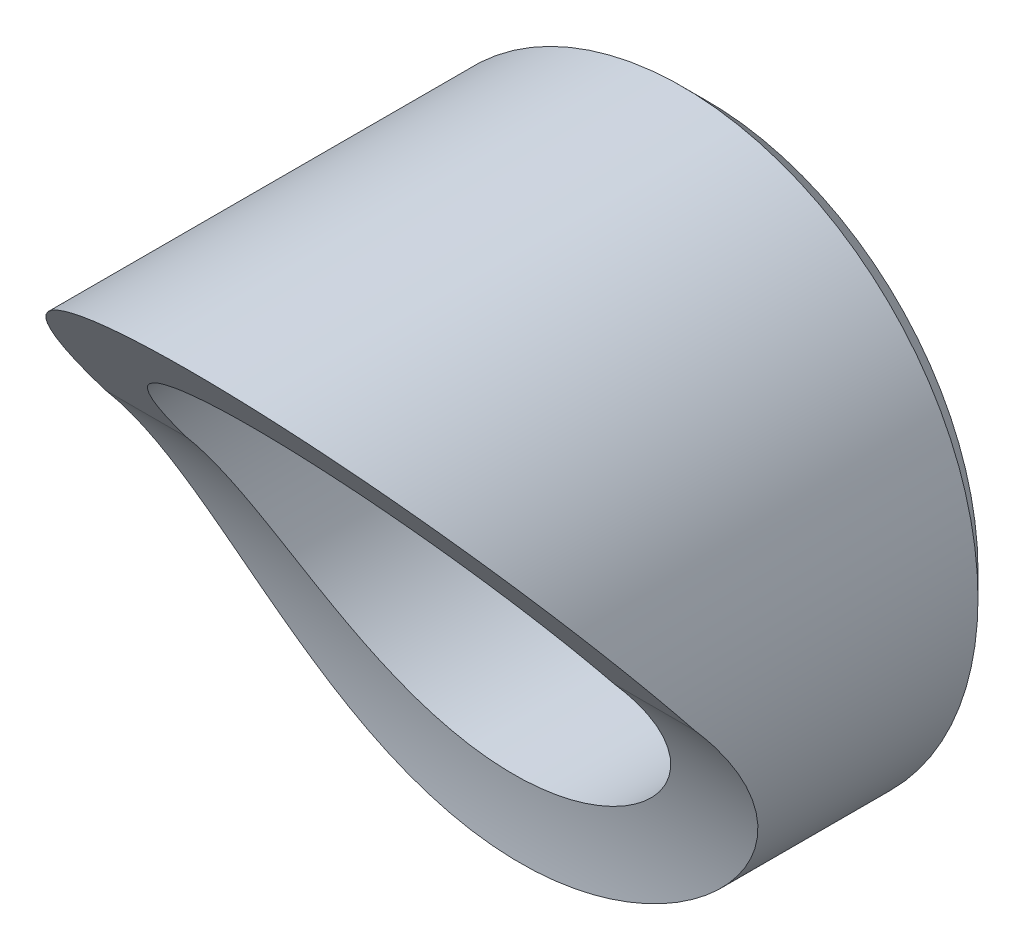
ISO-10303-21;
HEADER;
FILE_DESCRIPTION(('STEP AP214'),'2;1');
FILE_NAME('part.step','',(''),(''),'','','');
FILE_SCHEMA(('AUTOMOTIVE_DESIGN { 1 0 10303 214 1 1 1 1 }'));
ENDSEC;
DATA;
#1=APPLICATION_CONTEXT('core data for automotive mechanical design processes');
#2=APPLICATION_PROTOCOL_DEFINITION('international standard','automotive_design',2000,#1);
#3=PRODUCT_CONTEXT('',#1,'mechanical');
#4=PRODUCT('Part','Part','',(#3));
#5=PRODUCT_RELATED_PRODUCT_CATEGORY('part','',(#4));
#6=PRODUCT_DEFINITION_FORMATION('','',#4);
#7=PRODUCT_DEFINITION_CONTEXT('part definition',#1,'design');
#8=PRODUCT_DEFINITION('design','',#6,#7);
#9=PRODUCT_DEFINITION_SHAPE('','',#8);
#10=(LENGTH_UNIT() NAMED_UNIT(*) SI_UNIT(.MILLI.,.METRE.));
#11=(NAMED_UNIT(*) PLANE_ANGLE_UNIT() SI_UNIT($,.RADIAN.));
#12=(NAMED_UNIT(*) SI_UNIT($,.STERADIAN.) SOLID_ANGLE_UNIT());
#13=UNCERTAINTY_MEASURE_WITH_UNIT(LENGTH_MEASURE(1.E-05),#10,'distance_accuracy_value','');
#14=(GEOMETRIC_REPRESENTATION_CONTEXT(3) GLOBAL_UNCERTAINTY_ASSIGNED_CONTEXT((#13)) GLOBAL_UNIT_ASSIGNED_CONTEXT((#10,
#11,#12)) REPRESENTATION_CONTEXT('',''));
#15=CARTESIAN_POINT('',(0.,0.,0.));
#16=DIRECTION('',(0.,0.,1.));
#17=DIRECTION('',(1.,0.,0.));
#18=AXIS2_PLACEMENT_3D('',#15,#16,#17);
#19=CARTESIAN_POINT('',(0.,0.,0.));
#20=DIRECTION('',(0.,0.,1.));
#21=DIRECTION('',(1.,0.,0.));
#22=AXIS2_PLACEMENT_3D('',#19,#20,#21);
#23=PLANE('',#22);
#24=CARTESIAN_POINT('',(0.,0.,0.));
#25=DIRECTION('',(0.,0.,1.));
#26=DIRECTION('',(1.,0.,0.));
#27=AXIS2_PLACEMENT_3D('',#24,#25,#26);
#28=CIRCLE('',#27,11.);
#29=CARTESIAN_POINT('',(11.,0.,0.));
#30=VERTEX_POINT('',#29);
#31=EDGE_CURVE('E11',#30,#30,#28,.F.);
#32=ORIENTED_EDGE('',*,*,#31,.T.);
#33=EDGE_LOOP('',(#32));
#34=FACE_BOUND('',#33,.T.);
#35=CARTESIAN_POINT('',(0.,0.,0.));
#36=DIRECTION('',(0.,0.,-1.));
#37=DIRECTION('',(-1.,0.,0.));
#38=AXIS2_PLACEMENT_3D('',#35,#36,#37);
#39=CIRCLE('',#38,8.74999999999999);
#40=CARTESIAN_POINT('',(-8.74999999999999,0.,0.));
#41=VERTEX_POINT('',#40);
#42=EDGE_CURVE('E75',#41,#41,#39,.T.);
#43=ORIENTED_EDGE('',*,*,#42,.F.);
#44=EDGE_LOOP('',(#43));
#45=FACE_BOUND('',#44,.T.);
#46=ADVANCED_FACE('F37',(#34,#45),#23,.F.);
#47=CARTESIAN_POINT('',(0.,0.,21.));
#48=DIRECTION('',(0.,0.,-1.));
#49=DIRECTION('',(-1.,0.,0.));
#50=AXIS2_PLACEMENT_3D('',#47,#48,#49);
#51=CYLINDRICAL_SURFACE('',#50,12.);
#52=CARTESIAN_POINT('',(0.,0.,1.00000000000003));
#53=DIRECTION('',(0.,0.,1.));
#54=DIRECTION('',(1.,0.,0.));
#55=AXIS2_PLACEMENT_3D('',#52,#53,#54);
#56=CIRCLE('',#55,12.);
#57=CARTESIAN_POINT('',(12.,0.,1.00000000000003));
#58=VERTEX_POINT('',#57);
#59=EDGE_CURVE('E45',#58,#58,#56,.T.);
#60=ORIENTED_EDGE('',*,*,#59,.T.);
#61=EDGE_LOOP('',(#60));
#62=FACE_BOUND('',#61,.T.);
#63=CARTESIAN_POINT('',(-11.9532085110365,1.05868139290517,12.4517050372462));
#64=CARTESIAN_POINT('',(-11.9649680485447,0.925899042406535,12.3372383249539));
#65=CARTESIAN_POINT('',(-11.9746410331154,0.791512872460983,12.2244347730754));
#66=CARTESIAN_POINT('',(-11.9895163860847,0.519654237816515,12.0022731914124));
#67=CARTESIAN_POINT('',(-11.9947182092425,0.382181398807218,11.8929155834132));
#68=CARTESIAN_POINT('',(-12.0031713325132,-0.0348511411528026,11.5700651600148));
#69=CARTESIAN_POINT('',(-11.9992511327767,-0.318818687778992,11.3619725343735));
#70=CARTESIAN_POINT('',(-11.9698803592871,-0.898036923727318,10.9605528830697));
#71=CARTESIAN_POINT('',(-11.9443230607443,-1.19333660342622,10.7673042381404));
#72=CARTESIAN_POINT('',(-11.8693470507308,-1.79147760951586,10.3979786869024));
#73=CARTESIAN_POINT('',(-11.8199360247676,-2.094316477046,10.2218962717));
#74=CARTESIAN_POINT('',(-11.6949410153717,-2.70678359842109,9.88676224656956));
#75=CARTESIAN_POINT('',(-11.6191826594557,-3.01644387790017,9.72783358408849));
#76=CARTESIAN_POINT('',(-11.4400940046577,-3.63710853611669,9.42912608707081));
#77=CARTESIAN_POINT('',(-11.3367609457437,-3.94811304633474,9.28934917160895));
#78=CARTESIAN_POINT('',(-11.1020559390824,-4.56655065667086,9.02970234769952));
#79=CARTESIAN_POINT('',(-10.9707748651595,-4.87399200563844,8.90977010769909));
#80=CARTESIAN_POINT('',(-10.6798309250602,-5.48222684742475,8.68906985662808));
#81=CARTESIAN_POINT('',(-10.5201719527336,-5.78302124594083,8.58829922023552));
#82=CARTESIAN_POINT('',(-10.1934782211789,-6.33912008440593,8.41591854618011));
#83=CARTESIAN_POINT('',(-10.0295243841111,-6.59561114286801,8.34227219118477));
#84=CARTESIAN_POINT('',(-9.68074465158227,-7.09764612280406,8.20839334868609));
#85=CARTESIAN_POINT('',(-9.49592041398705,-7.34319091165016,8.14815979684835));
#86=CARTESIAN_POINT('',(-9.10630391557527,-7.82115048867659,8.03990437301612));
#87=CARTESIAN_POINT('',(-8.90149242386927,-8.05355228487592,7.99189442553803));
#88=CARTESIAN_POINT('',(-8.47339321058485,-8.50281655584076,7.90680336740878));
#89=CARTESIAN_POINT('',(-8.25010504994678,-8.71967866110917,7.86972251656045));
#90=CARTESIAN_POINT('',(-7.78983480916762,-9.13306197186499,7.8054598299214));
#91=CARTESIAN_POINT('',(-7.55308867329764,-9.32982577736101,7.77814646930648));
#92=CARTESIAN_POINT('',(-7.06469611562644,-9.70488903175977,7.73122563222779));
#93=CARTESIAN_POINT('',(-6.81305000122331,-9.88318886138017,7.71161799685265));
#94=CARTESIAN_POINT('',(-6.2965222240495,-10.2200227246054,7.67864650809114));
#95=CARTESIAN_POINT('',(-6.03164211583321,-10.3785590721516,7.66528192325373));
#96=CARTESIAN_POINT('',(-5.4902949035223,-10.6748246778051,7.64339755848708));
#97=CARTESIAN_POINT('',(-5.21382727845503,-10.8125529991027,7.63487799664058));
#98=CARTESIAN_POINT('',(-4.63468474827265,-11.0736785337249,7.6210105570138));
#99=CARTESIAN_POINT('',(-4.33142000261377,-11.1957804779704,7.61587539920552));
#100=CARTESIAN_POINT('',(-3.71590839646846,-11.4148476786724,7.60826130950286));
#101=CARTESIAN_POINT('',(-3.40366123979786,-11.5118121051919,7.60578246530055));
#102=CARTESIAN_POINT('',(-2.7722299013731,-11.6799616220395,7.6023837395958));
#103=CARTESIAN_POINT('',(-2.45304443519758,-11.7511418953697,7.60146414927532));
#104=CARTESIAN_POINT('',(-1.80992893305948,-11.867220834964,7.60035647971414));
#105=CARTESIAN_POINT('',(-1.48599885420079,-11.9121192634628,7.60016840709119));
#106=CARTESIAN_POINT('',(-0.825835947847297,-11.9762778075973,7.5999872630943));
#107=CARTESIAN_POINT('',(-0.489524551507235,-11.9947324562949,7.60000018123365));
#108=CARTESIAN_POINT('',(0.183464599421138,-12.0033159498973,7.59999986633404));
#109=CARTESIAN_POINT('',(0.520142362286802,-11.9934441409557,7.59998663269143));
#110=CARTESIAN_POINT('',(1.19150376785109,-11.9454419552188,7.60006005370447));
#111=CARTESIAN_POINT('',(1.52618725755158,-11.9073094377325,7.6001467159273));
#112=CARTESIAN_POINT('',(2.1911641038328,-11.8030532515224,7.6009019199389));
#113=CARTESIAN_POINT('',(2.52145747211912,-11.7369296574478,7.60157046017586));
#114=CARTESIAN_POINT('',(3.17614975410812,-11.5769561753776,7.60431438074769));
#115=CARTESIAN_POINT('',(3.50053147679172,-11.4830359703944,7.60639334647868));
#116=CARTESIAN_POINT('',(4.14021013936744,-11.2682072386058,7.61310382428097));
#117=CARTESIAN_POINT('',(4.45550701228029,-11.1472985128812,7.61773535516633));
#118=CARTESIAN_POINT('',(5.07474984326027,-10.8793717817309,7.63096967367675));
#119=CARTESIAN_POINT('',(5.37869504166136,-10.7323520327035,7.63957272656736));
#120=CARTESIAN_POINT('',(5.97296432579063,-10.4133290772892,7.66239644887625));
#121=CARTESIAN_POINT('',(6.26328856852058,-10.241326158964,7.67661705352608));
#122=CARTESIAN_POINT('',(6.82575743666643,-9.87525612196072,7.71234089184535));
#123=CARTESIAN_POINT('',(7.09803365526854,-9.68138529826406,7.7337823040319));
#124=CARTESIAN_POINT('',(7.62494744793611,-9.27207948880665,7.78583863593776));
#125=CARTESIAN_POINT('',(7.87958506302134,-9.05664455319755,7.81645353432261));
#126=CARTESIAN_POINT('',(8.36914081030322,-8.60628010593436,7.88871799223281));
#127=CARTESIAN_POINT('',(8.60406647963063,-8.37135811437853,7.9303633085762));
#128=CARTESIAN_POINT('',(9.05247592443487,-7.88430275609204,8.02648172831034));
#129=CARTESIAN_POINT('',(9.26596089943082,-7.63217035354054,8.08095411350816));
#130=CARTESIAN_POINT('',(9.66008710806491,-7.12604638894878,8.20131713171703));
#131=CARTESIAN_POINT('',(9.84182108117267,-6.87274240492446,8.26652310154005));
#132=CARTESIAN_POINT('',(10.1834063821222,-6.35564619854462,8.41111471845954));
#133=CARTESIAN_POINT('',(10.3432585023999,-6.09185435644619,8.49049985182747));
#134=CARTESIAN_POINT('',(10.6402962329474,-5.55676919717368,8.66421791870355));
#135=CARTESIAN_POINT('',(10.7774952042342,-5.28548041278892,8.75854197631932));
#136=CARTESIAN_POINT('',(11.029066071935,-4.73818584813483,8.96263606756644));
#137=CARTESIAN_POINT('',(11.1434385733859,-4.46218019310111,9.07240569166714));
#138=CARTESIAN_POINT('',(11.3453219927756,-3.91969265908097,9.30268080461118));
#139=CARTESIAN_POINT('',(11.4337399985252,-3.65328279310393,9.42256382901959));
#140=CARTESIAN_POINT('',(11.5902883751603,-3.1212369277994,9.67642747101772));
#141=CARTESIAN_POINT('',(11.6584185374805,-2.85560093645539,9.81040823351744));
#142=CARTESIAN_POINT('',(11.7753220701797,-2.32704329416518,10.0921822025655));
#143=CARTESIAN_POINT('',(11.8240741924735,-2.06412492897686,10.2399903527923));
#144=CARTESIAN_POINT('',(11.9032583908956,-1.54332409646266,10.5486181506219));
#145=CARTESIAN_POINT('',(11.9336926573644,-1.28544103061505,10.7094362399639));
#146=CARTESIAN_POINT('',(11.9871090659645,-0.665830347093428,11.1158604404286));
#147=CARTESIAN_POINT('',(12.0011398698879,-0.307553625565566,11.3679983320824));
#148=CARTESIAN_POINT('',(11.9993228587451,0.215901357155049,11.7627201251361));
#149=CARTESIAN_POINT('',(11.9949359006622,0.387753093711939,11.8967821051849));
#150=CARTESIAN_POINT('',(11.9791711692367,0.726782778147857,12.1702757282382));
#151=CARTESIAN_POINT('',(11.9677939225832,0.893961077158766,12.3097069659498));
#152=CARTESIAN_POINT('',(11.9532085110365,1.05868139290517,12.4517050372462));
#153=B_SPLINE_CURVE_WITH_KNOTS('',3,(#63,#64,#65,#66,#67,#68,#69,#70,#71,#72,#73,#74,#75,#76,
#77,#78,#79,#80,#81,#82,#83,#84,#85,#86,#87,#88,#89,#90,#91,#92,#93,#94,#95,#96,#97,#98,#99,
#100,#101,#102,#103,#104,#105,#106,#107,#108,#109,#110,#111,#112,#113,#114,#115,#116,#117,#118,
#119,#120,#121,#122,#123,#124,#125,#126,#127,#128,#129,#130,#131,#132,#133,#134,#135,#136,#137,
#138,#139,#140,#141,#142,#143,#144,#145,#146,#147,#148,#149,#150,#151,#152),.UNSPECIFIED.,.F.,
.F.,(4,2,2,2,2,2,2,2,2,2,2,2,2,2,2,2,2,2,2,2,2,2,2,2,2,2,2,2,2,2,2,2,2,2,2,2,2,2,2,2,2,2,2,2,4),
(0.,0.527059297221546,1.054182858157,2.10924668860024,3.16954513677232,4.22950219181391,
5.29661214135798,6.36382894112502,7.42762725406239,8.49127971132681,9.42971685483765,
10.3680795048127,11.3073540800933,12.2466509816958,13.1727758384297,14.0988815951434,
15.0248788198159,15.9509177219079,16.9306896942897,17.9104940105868,18.8904812797285,
19.8704774144257,20.879731894125,21.8890096701607,22.8983639047386,23.9077154474881,
24.9196424915939,25.9315769943594,26.9435790959481,27.955569529841,28.9591071475636,
29.9626424314132,30.9657922344982,31.9688858841558,32.9231646906831,33.8774089295264,
34.8310883209284,35.7847424308117,36.6994044793581,37.6140759305922,38.529747573519,
39.4453097041084,40.7578104002271,41.4116344473531,42.0654092376129),.UNSPECIFIED.);
#154=CARTESIAN_POINT('',(-11.9532085110365,1.05868139290517,12.4517050372462));
#155=VERTEX_POINT('',#154);
#156=CARTESIAN_POINT('',(11.9532085110366,1.05868139290517,12.4517050372462));
#157=VERTEX_POINT('',#156);
#158=EDGE_CURVE('E67',#155,#157,#153,.T.);
#159=ORIENTED_EDGE('',*,*,#158,.F.);
#160=CARTESIAN_POINT('',(0.,0.,11.6245724819193));
#161=DIRECTION('',(0.,-0.615661475325663,0.788010753606719));
#162=DIRECTION('',(0.,-0.788010753606719,-0.615661475325663));
#163=AXIS2_PLACEMENT_3D('',#160,#161,#162);
#164=ELLIPSE('',#163,15.228218580871,12.);
#165=EDGE_CURVE('E78',#157,#155,#164,.T.);
#166=ORIENTED_EDGE('',*,*,#165,.F.);
#167=EDGE_LOOP('',(#159,#166));
#168=FACE_BOUND('',#167,.T.);
#169=ADVANCED_FACE('F93',(#62,#168),#51,.T.);
#170=CARTESIAN_POINT('',(21.,-12.,27.6));
#171=DIRECTION('',(-1.,0.,0.));
#172=DIRECTION('',(0.,0.,1.));
#173=AXIS2_PLACEMENT_3D('',#170,#171,#172);
#174=CYLINDRICAL_SURFACE('',#173,20.);
#175=CARTESIAN_POINT('',(-8.68571780040752,1.05868139290517,12.4517050372462));
#176=CARTESIAN_POINT('',(-8.71301496354657,0.834782660840368,12.2586368258677));
#177=CARTESIAN_POINT('',(-8.73211965779735,0.60587955328003,12.0700177939099));
#178=CARTESIAN_POINT('',(-8.75201508913884,0.139125287992815,11.7025302831255));
#179=CARTESIAN_POINT('',(-8.75278084816965,-0.0987376319044174,11.5236754338957));
#180=CARTESIAN_POINT('',(-8.73393887979672,-0.582903335716008,11.1762609507119));
#181=CARTESIAN_POINT('',(-8.71423243889775,-0.82924142295045,11.0077553872437));
#182=CARTESIAN_POINT('',(-8.65240441602306,-1.32712692007811,10.6832046959746));
#183=CARTESIAN_POINT('',(-8.61029539975757,-1.57867133377515,10.5271526393165));
#184=CARTESIAN_POINT('',(-8.5107011199052,-2.04392412396784,10.2524524426005));
#185=CARTESIAN_POINT('',(-8.45676866279973,-2.25722507012363,10.1318209929753));
#186=CARTESIAN_POINT('',(-8.33115328008892,-2.68399713191335,9.9005377887235));
#187=CARTESIAN_POINT('',(-8.25947338033156,-2.89746821236239,9.78988433728213));
#188=CARTESIAN_POINT('',(-8.09801084968335,-3.32207437564534,9.5791885948985));
#189=CARTESIAN_POINT('',(-8.00827376040253,-3.53321395304574,9.47912055657387));
#190=CARTESIAN_POINT('',(-7.81034003576578,-3.95153437732853,9.28948553254135));
#191=CARTESIAN_POINT('',(-7.70214362190453,-4.15871527167825,9.19991842085389));
#192=CARTESIAN_POINT('',(-7.46686919292568,-4.56774169653582,9.03092031975431));
#193=CARTESIAN_POINT('',(-7.33971168793226,-4.7695603353746,8.95153475379729));
#194=CARTESIAN_POINT('',(-7.06729746558753,-5.16462746487556,8.80313273112984));
#195=CARTESIAN_POINT('',(-6.92204038878588,-5.35787578523122,8.73411648040997));
#196=CARTESIAN_POINT('',(-6.61408107148286,-5.73371633904834,8.60597060157819));
#197=CARTESIAN_POINT('',(-6.45136515217124,-5.91630004137161,8.54684881987956));
#198=CARTESIAN_POINT('',(-6.10965773416909,-6.26855547887851,8.43794006037733));
#199=CARTESIAN_POINT('',(-5.93066694834594,-6.43822777900653,8.38815267400325));
#200=CARTESIAN_POINT('',(-5.56926687940754,-6.75274465322183,8.29996565684957));
#201=CARTESIAN_POINT('',(-5.38775262467511,-6.89847558516065,8.26105238068875));
#202=CARTESIAN_POINT('',(-5.01280996946792,-7.17555360784844,8.19007533198781));
#203=CARTESIAN_POINT('',(-4.81938211189769,-7.30690135328458,8.15801124762615));
#204=CARTESIAN_POINT('',(-4.42200490435363,-7.55401268379939,8.10001772026698));
#205=CARTESIAN_POINT('',(-4.21805780985025,-7.66977959057034,8.0740869688033));
#206=CARTESIAN_POINT('',(-3.80103241086471,-7.8847757560836,8.0276462587533));
#207=CARTESIAN_POINT('',(-3.58795392663388,-7.9840046890927,8.00713640693277));
#208=CARTESIAN_POINT('',(-3.15269019600204,-8.16572346175224,7.97076226779791));
#209=CARTESIAN_POINT('',(-2.93045314118643,-8.2480956574233,7.95493030900395));
#210=CARTESIAN_POINT('',(-2.47979299120783,-8.39459753769734,7.92751589399679));
#211=CARTESIAN_POINT('',(-2.25136989632374,-8.4587272231228,7.915933437592));
#212=CARTESIAN_POINT('',(-1.78989295466535,-8.56825708326667,7.89654249529372));
#213=CARTESIAN_POINT('',(-1.5568385811094,-8.61365511443619,7.88873444130484));
#214=CARTESIAN_POINT('',(-1.08772299014467,-8.68537069905675,7.87654805048293));
#215=CARTESIAN_POINT('',(-0.851661735653149,-8.71168801696023,7.87216975598955));
#216=CARTESIAN_POINT('',(-0.373896841524312,-8.74534564283677,7.86658860481817));
#217=CARTESIAN_POINT('',(-0.132167898589995,-8.75233741221128,7.86544406121629));
#218=CARTESIAN_POINT('',(0.351034666580367,-8.74629388677619,7.86643962935583));
#219=CARTESIAN_POINT('',(0.592508285584296,-8.73325834140973,7.8685797821913));
#220=CARTESIAN_POINT('',(1.07351123800022,-8.68725769420589,7.87625083834381));
#221=CARTESIAN_POINT('',(1.31304045253177,-8.6542913829691,7.88178194742446));
#222=CARTESIAN_POINT('',(1.78844290943358,-8.56868167499779,7.89649934539758));
#223=CARTESIAN_POINT('',(2.02431615639438,-8.51603830297245,7.90568562970013));
#224=CARTESIAN_POINT('',(2.49159516244736,-8.39125437678038,7.92816770975851));
#225=CARTESIAN_POINT('',(2.72298097562373,-8.31904182899646,7.94147870651201));
#226=CARTESIAN_POINT('',(3.17869470896729,-8.15579425862209,7.97274895676248));
#227=CARTESIAN_POINT('',(3.40302259709259,-8.06475915059433,7.99070823135849));
#228=CARTESIAN_POINT('',(3.84295122980931,-7.86464332723447,8.03193280154851));
#229=CARTESIAN_POINT('',(4.05855277680372,-7.75556427578945,8.05519760797805));
#230=CARTESIAN_POINT('',(4.47944977929908,-7.52031580858146,8.10777212971825));
#231=CARTESIAN_POINT('',(4.68474537998744,-7.3941466336722,8.13708175984133));
#232=CARTESIAN_POINT('',(5.08119463326537,-7.12743810819233,8.20214564131289));
#233=CARTESIAN_POINT('',(5.27248456956785,-6.98708217401814,8.23782129617424));
#234=CARTESIAN_POINT('',(5.64213205011197,-6.69214090499752,8.31658951502437));
#235=CARTESIAN_POINT('',(5.82048972627287,-6.53755571533724,8.35968200334046));
#236=CARTESIAN_POINT('',(6.16300242906372,-6.2157150716135,8.45397821264958));
#237=CARTESIAN_POINT('',(6.32716021841015,-6.04846209411338,8.50518035032406));
#238=CARTESIAN_POINT('',(6.64025244932787,-5.70297223130985,8.61631339064852));
#239=CARTESIAN_POINT('',(6.7891871307723,-5.52473551914998,8.67624415572393));
#240=CARTESIAN_POINT('',(7.0683303209591,-5.16260414074128,8.80409136571834));
#241=CARTESIAN_POINT('',(7.1988399136248,-4.97888041893432,8.87183519133124));
#242=CARTESIAN_POINT('',(7.44385775118119,-4.60451173089009,9.01648542947362));
#243=CARTESIAN_POINT('',(7.55836625522527,-4.4138668768104,9.09339169357099));
#244=CARTESIAN_POINT('',(7.77107392135476,-4.02759412670618,9.25648124694833));
#245=CARTESIAN_POINT('',(7.86927704297487,-3.8319674537945,9.34266227557839));
#246=CARTESIAN_POINT('',(8.04939443806622,-3.43755098137936,9.52428133482503));
#247=CARTESIAN_POINT('',(8.13130851119136,-3.23876114300323,9.61971947927742));
#248=CARTESIAN_POINT('',(8.28084459385027,-2.83505611331854,9.82203671535951));
#249=CARTESIAN_POINT('',(8.34808101354871,-2.63010756540793,9.92913367690457));
#250=CARTESIAN_POINT('',(8.46624448566017,-2.22050662337474,10.152480496658));
#251=CARTESIAN_POINT('',(8.51717066034485,-2.01585424578021,10.2687308470325));
#252=CARTESIAN_POINT('',(8.60347000563035,-1.6081853835897,10.5100512922051));
#253=CARTESIAN_POINT('',(8.63882628201961,-1.40517090944966,10.6351307972835));
#254=CARTESIAN_POINT('',(8.69477269362107,-1.00238938017382,10.8934191694527));
#255=CARTESIAN_POINT('',(8.71536450674711,-0.802621958547964,11.0266271109162));
#256=CARTESIAN_POINT('',(8.74907010136775,-0.316232672591609,11.3638413379706));
#257=CARTESIAN_POINT('',(8.75436127749527,-0.0320221520012271,11.5721780620833));
#258=CARTESIAN_POINT('',(8.74264048037944,0.384682878258842,11.8948912571375));
#259=CARTESIAN_POINT('',(8.73548934505673,0.52173193442596,12.0039472761253));
#260=CARTESIAN_POINT('',(8.71508164835649,0.792639401848382,12.2253794368203));
#261=CARTESIAN_POINT('',(8.70182562636436,0.926498093883416,12.3377552843898));
#262=CARTESIAN_POINT('',(8.68571780040753,1.05868139290517,12.4517050372462));
#263=B_SPLINE_CURVE_WITH_KNOTS('',3,(#175,#176,#177,#178,#179,#180,#181,#182,#183,#184,#185,
#186,#187,#188,#189,#190,#191,#192,#193,#194,#195,#196,#197,#198,#199,#200,#201,#202,#203,#204,
#205,#206,#207,#208,#209,#210,#211,#212,#213,#214,#215,#216,#217,#218,#219,#220,#221,#222,#223,
#224,#225,#226,#227,#228,#229,#230,#231,#232,#233,#234,#235,#236,#237,#238,#239,#240,#241,#242,
#243,#244,#245,#246,#247,#248,#249,#250,#251,#252,#253,#254,#255,#256,#257,#258,#259,#260,#261,
#262),.UNSPECIFIED.,.F.,.F.,(4,2,2,2,2,2,2,2,2,2,2,2,2,2,2,2,2,2,2,2,2,2,2,2,2,2,2,2,2,2,2,2,2,
2,2,2,2,2,2,2,2,2,2,4),(0.,0.890712633126236,1.78263836885528,2.67888487113213,3.57462919370654,
4.32660097222064,5.07844463158067,5.82841532916556,6.5783770284343,7.33157607854112,
8.08479008926793,8.83859860467801,9.59237411785949,10.2995616865269,11.0067170523685,
11.7137214195372,12.4207397102734,13.1325356139646,13.8443314855638,14.5562087886454,
15.2680948795596,15.99273866234,16.7173915110364,17.4420883361013,18.1667842511421,
18.8941833407339,19.6215857321286,20.3489210848826,21.0762461882554,21.7951450424887,
22.5140365623536,23.2327878992942,23.9515279090002,24.6566639574363,25.3617885841754,
26.0667417300063,26.7717035458271,27.4934062145917,28.2151477149307,28.937670427135,
29.6601110149122,30.7155705074127,31.2413101846508,31.767003420091),.UNSPECIFIED.);
#264=CARTESIAN_POINT('',(-8.68571780040752,1.05868139290517,12.4517050372462));
#265=VERTEX_POINT('',#264);
#266=CARTESIAN_POINT('',(8.68571780040753,1.05868139290517,12.4517050372462));
#267=VERTEX_POINT('',#266);
#268=EDGE_CURVE('E63',#265,#267,#263,.T.);
#269=ORIENTED_EDGE('',*,*,#268,.F.);
#270=DIRECTION('',(-1.,0.,0.));
#271=VECTOR('',#270,1.);
#272=CARTESIAN_POINT('',(21.,1.05868139290517,12.4517050372462));
#273=LINE('',#272,#271);
#274=EDGE_CURVE('E58',#265,#155,#273,.T.);
#275=ORIENTED_EDGE('',*,*,#274,.T.);
#276=ORIENTED_EDGE('',*,*,#158,.T.);
#277=EDGE_CURVE('E73',#157,#267,#273,.T.);
#278=ORIENTED_EDGE('',*,*,#277,.T.);
#279=EDGE_LOOP('',(#269,#275,#276,#278));
#280=FACE_BOUND('',#279,.T.);
#281=ADVANCED_FACE('F77',(#280),#174,.F.);
#282=CARTESIAN_POINT('',(21.,12.,21.));
#283=DIRECTION('',(0.,-0.615661475325663,0.788010753606719));
#284=DIRECTION('',(0.,-0.788010753606719,-0.615661475325663));
#285=AXIS2_PLACEMENT_3D('',#282,#283,#284);
#286=PLANE('',#285);
#287=CARTESIAN_POINT('',(0.,0.,11.6245724819193));
#288=DIRECTION('',(0.,-0.615661475325663,0.788010753606719));
#289=DIRECTION('',(0.,-0.788010753606719,-0.615661475325663));
#290=AXIS2_PLACEMENT_3D('',#287,#288,#289);
#291=ELLIPSE('',#290,11.1039093818851,8.74999999999999);
#292=EDGE_CURVE('E51',#267,#265,#291,.T.);
#293=ORIENTED_EDGE('',*,*,#292,.F.);
#294=ORIENTED_EDGE('',*,*,#277,.F.);
#295=ORIENTED_EDGE('',*,*,#165,.T.);
#296=ORIENTED_EDGE('',*,*,#274,.F.);
#297=EDGE_LOOP('',(#293,#294,#295,#296));
#298=FACE_BOUND('',#297,.T.);
#299=ADVANCED_FACE('F71',(#298),#286,.T.);
#300=CARTESIAN_POINT('',(0.,0.,0.));
#301=DIRECTION('',(0.,0.,-1.));
#302=DIRECTION('',(-1.,0.,0.));
#303=AXIS2_PLACEMENT_3D('',#300,#301,#302);
#304=CYLINDRICAL_SURFACE('',#303,8.74999999999999);
#305=ORIENTED_EDGE('',*,*,#292,.T.);
#306=ORIENTED_EDGE('',*,*,#268,.T.);
#307=EDGE_LOOP('',(#305,#306));
#308=FACE_BOUND('',#307,.T.);
#309=ORIENTED_EDGE('',*,*,#42,.T.);
#310=EDGE_LOOP('',(#309));
#311=FACE_BOUND('',#310,.T.);
#312=ADVANCED_FACE('F64',(#308,#311),#304,.F.);
#313=CARTESIAN_POINT('',(0.,0.,1.00000000000003));
#314=DIRECTION('',(0.,0.,1.));
#315=DIRECTION('',(1.,0.,0.));
#316=AXIS2_PLACEMENT_3D('',#313,#314,#315);
#317=CONICAL_SURFACE('',#316,12.,0.785398163397448);
#318=ORIENTED_EDGE('',*,*,#31,.F.);
#319=EDGE_LOOP('',(#318));
#320=FACE_BOUND('',#319,.T.);
#321=ORIENTED_EDGE('',*,*,#59,.F.);
#322=EDGE_LOOP('',(#321));
#323=FACE_BOUND('',#322,.T.);
#324=ADVANCED_FACE('F39',(#320,#323),#317,.T.);
#325=CLOSED_SHELL('',(#46,#169,#281,#299,#312,#324));
#326=MANIFOLD_SOLID_BREP('B2',#325);
#327=ADVANCED_BREP_SHAPE_REPRESENTATION('',(#18,#326),#14);
#328=SHAPE_DEFINITION_REPRESENTATION(#9,#327);
ENDSEC;
END-ISO-10303-21;
